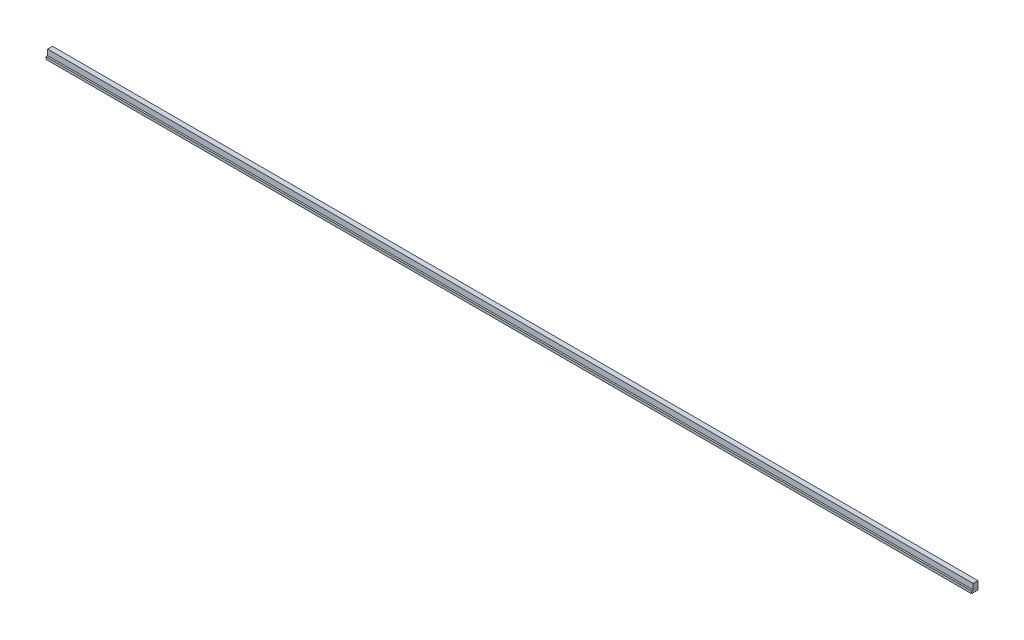
ISO-10303-21;
HEADER;
FILE_DESCRIPTION(('STEP AP214'),'2;1');
FILE_NAME('part.step','',(''),(''),'','','');
FILE_SCHEMA(('AUTOMOTIVE_DESIGN { 1 0 10303 214 1 1 1 1 }'));
ENDSEC;
DATA;
#1=APPLICATION_CONTEXT('core data for automotive mechanical design processes');
#2=APPLICATION_PROTOCOL_DEFINITION('international standard','automotive_design',2000,#1);
#3=PRODUCT_CONTEXT('',#1,'mechanical');
#4=PRODUCT('Part','Part','',(#3));
#5=PRODUCT_RELATED_PRODUCT_CATEGORY('part','',(#4));
#6=PRODUCT_DEFINITION_FORMATION('','',#4);
#7=PRODUCT_DEFINITION_CONTEXT('part definition',#1,'design');
#8=PRODUCT_DEFINITION('design','',#6,#7);
#9=PRODUCT_DEFINITION_SHAPE('','',#8);
#10=(LENGTH_UNIT() NAMED_UNIT(*) SI_UNIT(.MILLI.,.METRE.));
#11=(NAMED_UNIT(*) PLANE_ANGLE_UNIT() SI_UNIT($,.RADIAN.));
#12=(NAMED_UNIT(*) SI_UNIT($,.STERADIAN.) SOLID_ANGLE_UNIT());
#13=UNCERTAINTY_MEASURE_WITH_UNIT(LENGTH_MEASURE(1.E-05),#10,'distance_accuracy_value','');
#14=(GEOMETRIC_REPRESENTATION_CONTEXT(3) GLOBAL_UNCERTAINTY_ASSIGNED_CONTEXT((#13)) GLOBAL_UNIT_ASSIGNED_CONTEXT((#10,
#11,#12)) REPRESENTATION_CONTEXT('',''));
#15=CARTESIAN_POINT('',(0.,0.,0.));
#16=DIRECTION('',(0.,0.,1.));
#17=DIRECTION('',(1.,0.,0.));
#18=AXIS2_PLACEMENT_3D('',#15,#16,#17);
#19=CARTESIAN_POINT('',(2849.99999999997,25.,15.));
#20=DIRECTION('',(-1.,0.,0.));
#21=DIRECTION('',(0.,0.,1.));
#22=AXIS2_PLACEMENT_3D('',#19,#20,#21);
#23=PLANE('',#22);
#24=DIRECTION('',(0.,1.,0.));
#25=VECTOR('',#24,1.);
#26=CARTESIAN_POINT('',(2849.99999999997,25.,-15.));
#27=LINE('',#26,#25);
#28=CARTESIAN_POINT('',(2849.99999999997,-25.,-15.));
#29=VERTEX_POINT('',#28);
#30=CARTESIAN_POINT('',(2849.99999999997,25.,-15.));
#31=VERTEX_POINT('',#30);
#32=EDGE_CURVE('E94',#29,#31,#27,.T.);
#33=ORIENTED_EDGE('',*,*,#32,.T.);
#34=DIRECTION('',(0.,0.,-1.));
#35=VECTOR('',#34,1.);
#36=CARTESIAN_POINT('',(2849.99999999997,25.,15.));
#37=LINE('',#36,#35);
#38=CARTESIAN_POINT('',(2849.99999999997,25.,15.));
#39=VERTEX_POINT('',#38);
#40=EDGE_CURVE('E11',#39,#31,#37,.T.);
#41=ORIENTED_EDGE('',*,*,#40,.F.);
#42=DIRECTION('',(0.,1.,0.));
#43=VECTOR('',#42,1.);
#44=CARTESIAN_POINT('',(2849.99999999997,25.,15.));
#45=LINE('',#44,#43);
#46=CARTESIAN_POINT('',(2849.99999999997,-10.,15.));
#47=VERTEX_POINT('',#46);
#48=EDGE_CURVE('E87',#47,#39,#45,.T.);
#49=ORIENTED_EDGE('',*,*,#48,.F.);
#50=DIRECTION('',(0.,0.,-1.));
#51=VECTOR('',#50,1.);
#52=CARTESIAN_POINT('',(2849.99999999997,-10.,25.));
#53=LINE('',#52,#51);
#54=CARTESIAN_POINT('',(2849.99999999997,-10.,25.));
#55=VERTEX_POINT('',#54);
#56=EDGE_CURVE('E102',#55,#47,#53,.T.);
#57=ORIENTED_EDGE('',*,*,#56,.F.);
#58=DIRECTION('',(0.,1.,0.));
#59=VECTOR('',#58,1.);
#60=CARTESIAN_POINT('',(2849.99999999997,-25.,25.));
#61=LINE('',#60,#59);
#62=CARTESIAN_POINT('',(2849.99999999997,-25.,25.));
#63=VERTEX_POINT('',#62);
#64=EDGE_CURVE('E97',#63,#55,#61,.T.);
#65=ORIENTED_EDGE('',*,*,#64,.F.);
#66=DIRECTION('',(0.,0.,-1.));
#67=VECTOR('',#66,1.);
#68=CARTESIAN_POINT('',(2849.99999999997,-25.,15.));
#69=LINE('',#68,#67);
#70=EDGE_CURVE('E80',#63,#29,#69,.T.);
#71=ORIENTED_EDGE('',*,*,#70,.T.);
#72=EDGE_LOOP('',(#33,#41,#49,#57,#65,#71));
#73=FACE_BOUND('',#72,.T.);
#74=ADVANCED_FACE('F35',(#73),#23,.F.);
#75=CARTESIAN_POINT('',(-2850.00000000003,25.,15.));
#76=DIRECTION('',(0.,-1.,0.));
#77=DIRECTION('',(0.,0.,-1.));
#78=AXIS2_PLACEMENT_3D('',#75,#76,#77);
#79=PLANE('',#78);
#80=DIRECTION('',(-1.,0.,0.));
#81=VECTOR('',#80,1.);
#82=CARTESIAN_POINT('',(-2850.00000000003,25.,-15.));
#83=LINE('',#82,#81);
#84=CARTESIAN_POINT('',(-2850.00000000003,25.,-15.));
#85=VERTEX_POINT('',#84);
#86=EDGE_CURVE('E101',#31,#85,#83,.T.);
#87=ORIENTED_EDGE('',*,*,#86,.T.);
#88=DIRECTION('',(0.,0.,-1.));
#89=VECTOR('',#88,1.);
#90=CARTESIAN_POINT('',(-2850.00000000003,25.,15.));
#91=LINE('',#90,#89);
#92=CARTESIAN_POINT('',(-2850.00000000003,25.,15.));
#93=VERTEX_POINT('',#92);
#94=EDGE_CURVE('E42',#93,#85,#91,.T.);
#95=ORIENTED_EDGE('',*,*,#94,.F.);
#96=DIRECTION('',(-1.,0.,0.));
#97=VECTOR('',#96,1.);
#98=CARTESIAN_POINT('',(-2850.00000000003,25.,15.));
#99=LINE('',#98,#97);
#100=EDGE_CURVE('E55',#39,#93,#99,.T.);
#101=ORIENTED_EDGE('',*,*,#100,.F.);
#102=ORIENTED_EDGE('',*,*,#40,.T.);
#103=EDGE_LOOP('',(#87,#95,#101,#102));
#104=FACE_BOUND('',#103,.T.);
#105=ADVANCED_FACE('F118',(#104),#79,.F.);
#106=CARTESIAN_POINT('',(-2850.00000000003,25.,15.));
#107=DIRECTION('',(1.,0.,0.));
#108=DIRECTION('',(0.,0.,-1.));
#109=AXIS2_PLACEMENT_3D('',#106,#107,#108);
#110=PLANE('',#109);
#111=DIRECTION('',(0.,-1.,0.));
#112=VECTOR('',#111,1.);
#113=CARTESIAN_POINT('',(-2850.00000000003,25.,-15.));
#114=LINE('',#113,#112);
#115=CARTESIAN_POINT('',(-2850.00000000003,-25.,-15.));
#116=VERTEX_POINT('',#115);
#117=EDGE_CURVE('E88',#85,#116,#114,.T.);
#118=ORIENTED_EDGE('',*,*,#117,.T.);
#119=DIRECTION('',(0.,0.,-1.));
#120=VECTOR('',#119,1.);
#121=CARTESIAN_POINT('',(-2850.00000000003,-25.,15.));
#122=LINE('',#121,#120);
#123=CARTESIAN_POINT('',(-2850.00000000003,-25.,25.));
#124=VERTEX_POINT('',#123);
#125=EDGE_CURVE('E83',#124,#116,#122,.T.);
#126=ORIENTED_EDGE('',*,*,#125,.F.);
#127=DIRECTION('',(0.,-1.,0.));
#128=VECTOR('',#127,1.);
#129=CARTESIAN_POINT('',(-2850.00000000003,-25.,25.));
#130=LINE('',#129,#128);
#131=CARTESIAN_POINT('',(-2850.00000000003,-10.,25.));
#132=VERTEX_POINT('',#131);
#133=EDGE_CURVE('E138',#132,#124,#130,.T.);
#134=ORIENTED_EDGE('',*,*,#133,.F.);
#135=DIRECTION('',(0.,0.,-1.));
#136=VECTOR('',#135,1.);
#137=CARTESIAN_POINT('',(-2850.00000000003,-10.,25.));
#138=LINE('',#137,#136);
#139=CARTESIAN_POINT('',(-2850.00000000003,-10.,15.));
#140=VERTEX_POINT('',#139);
#141=EDGE_CURVE('E106',#132,#140,#138,.T.);
#142=ORIENTED_EDGE('',*,*,#141,.T.);
#143=DIRECTION('',(0.,-1.,0.));
#144=VECTOR('',#143,1.);
#145=CARTESIAN_POINT('',(-2850.00000000003,25.,15.));
#146=LINE('',#145,#144);
#147=EDGE_CURVE('E98',#93,#140,#146,.T.);
#148=ORIENTED_EDGE('',*,*,#147,.F.);
#149=ORIENTED_EDGE('',*,*,#94,.T.);
#150=EDGE_LOOP('',(#118,#126,#134,#142,#148,#149));
#151=FACE_BOUND('',#150,.T.);
#152=ADVANCED_FACE('F115',(#151),#110,.F.);
#153=CARTESIAN_POINT('',(-2850.00000000003,-25.,15.));
#154=DIRECTION('',(0.,1.,0.));
#155=DIRECTION('',(0.,0.,1.));
#156=AXIS2_PLACEMENT_3D('',#153,#154,#155);
#157=PLANE('',#156);
#158=DIRECTION('',(1.,0.,0.));
#159=VECTOR('',#158,1.);
#160=CARTESIAN_POINT('',(-2850.00000000003,-25.,-15.));
#161=LINE('',#160,#159);
#162=EDGE_CURVE('E75',#116,#29,#161,.T.);
#163=ORIENTED_EDGE('',*,*,#162,.T.);
#164=ORIENTED_EDGE('',*,*,#70,.F.);
#165=DIRECTION('',(1.,0.,0.));
#166=VECTOR('',#165,1.);
#167=CARTESIAN_POINT('',(-2850.00000000003,-25.,25.));
#168=LINE('',#167,#166);
#169=EDGE_CURVE('E134',#124,#63,#168,.T.);
#170=ORIENTED_EDGE('',*,*,#169,.F.);
#171=ORIENTED_EDGE('',*,*,#125,.T.);
#172=EDGE_LOOP('',(#163,#164,#170,#171));
#173=FACE_BOUND('',#172,.T.);
#174=ADVANCED_FACE('F77',(#173),#157,.F.);
#175=CARTESIAN_POINT('',(0.,0.,15.));
#176=DIRECTION('',(0.,0.,1.));
#177=DIRECTION('',(1.,0.,0.));
#178=AXIS2_PLACEMENT_3D('',#175,#176,#177);
#179=PLANE('',#178);
#180=DIRECTION('',(-1.,0.,0.));
#181=VECTOR('',#180,1.);
#182=CARTESIAN_POINT('',(-2850.00000000003,-10.,15.));
#183=LINE('',#182,#181);
#184=EDGE_CURVE('E49',#47,#140,#183,.T.);
#185=ORIENTED_EDGE('',*,*,#184,.F.);
#186=ORIENTED_EDGE('',*,*,#48,.T.);
#187=ORIENTED_EDGE('',*,*,#100,.T.);
#188=ORIENTED_EDGE('',*,*,#147,.T.);
#189=EDGE_LOOP('',(#185,#186,#187,#188));
#190=FACE_BOUND('',#189,.T.);
#191=ADVANCED_FACE('F139',(#190),#179,.T.);
#192=CARTESIAN_POINT('',(0.,0.,-15.));
#193=DIRECTION('',(0.,0.,1.));
#194=DIRECTION('',(1.,0.,0.));
#195=AXIS2_PLACEMENT_3D('',#192,#193,#194);
#196=PLANE('',#195);
#197=ORIENTED_EDGE('',*,*,#32,.F.);
#198=ORIENTED_EDGE('',*,*,#162,.F.);
#199=ORIENTED_EDGE('',*,*,#117,.F.);
#200=ORIENTED_EDGE('',*,*,#86,.F.);
#201=EDGE_LOOP('',(#197,#198,#199,#200));
#202=FACE_BOUND('',#201,.T.);
#203=ADVANCED_FACE('F100',(#202),#196,.F.);
#204=CARTESIAN_POINT('',(-2850.00000000003,-10.,25.));
#205=DIRECTION('',(0.,-1.,0.));
#206=DIRECTION('',(0.,0.,-1.));
#207=AXIS2_PLACEMENT_3D('',#204,#205,#206);
#208=PLANE('',#207);
#209=ORIENTED_EDGE('',*,*,#184,.T.);
#210=ORIENTED_EDGE('',*,*,#141,.F.);
#211=DIRECTION('',(-1.,0.,0.));
#212=VECTOR('',#211,1.);
#213=CARTESIAN_POINT('',(-2850.00000000003,-10.,25.));
#214=LINE('',#213,#212);
#215=EDGE_CURVE('E127',#55,#132,#214,.T.);
#216=ORIENTED_EDGE('',*,*,#215,.F.);
#217=ORIENTED_EDGE('',*,*,#56,.T.);
#218=EDGE_LOOP('',(#209,#210,#216,#217));
#219=FACE_BOUND('',#218,.T.);
#220=ADVANCED_FACE('F123',(#219),#208,.F.);
#221=CARTESIAN_POINT('',(0.,0.,25.));
#222=DIRECTION('',(0.,0.,-1.));
#223=DIRECTION('',(-1.,0.,0.));
#224=AXIS2_PLACEMENT_3D('',#221,#222,#223);
#225=PLANE('',#224);
#226=ORIENTED_EDGE('',*,*,#133,.T.);
#227=ORIENTED_EDGE('',*,*,#169,.T.);
#228=ORIENTED_EDGE('',*,*,#64,.T.);
#229=ORIENTED_EDGE('',*,*,#215,.T.);
#230=EDGE_LOOP('',(#226,#227,#228,#229));
#231=FACE_BOUND('',#230,.T.);
#232=ADVANCED_FACE('F144',(#231),#225,.F.);
#233=CLOSED_SHELL('',(#74,#105,#152,#174,#191,#203,#220,#232));
#234=MANIFOLD_SOLID_BREP('B2',#233);
#235=ADVANCED_BREP_SHAPE_REPRESENTATION('',(#18,#234),#14);
#236=SHAPE_DEFINITION_REPRESENTATION(#9,#235);
ENDSEC;
END-ISO-10303-21;
